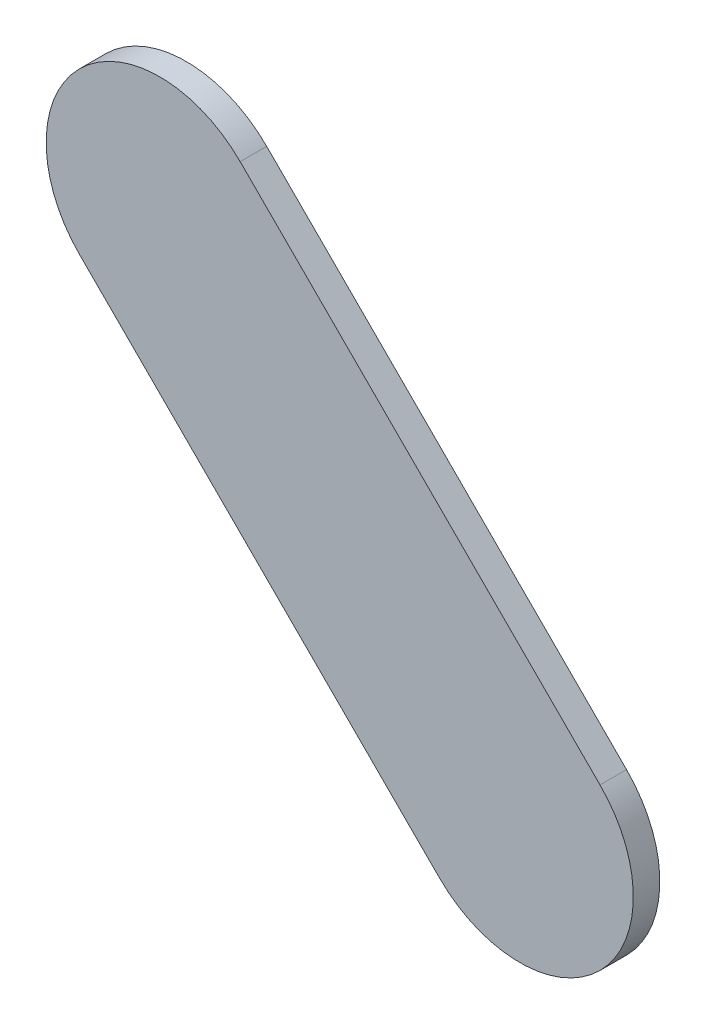
ISO-10303-21;
HEADER;
FILE_DESCRIPTION(('STEP AP214'),'2;1');
FILE_NAME('part.step','',(''),(''),'','','');
FILE_SCHEMA(('AUTOMOTIVE_DESIGN { 1 0 10303 214 1 1 1 1 }'));
ENDSEC;
DATA;
#1=APPLICATION_CONTEXT('core data for automotive mechanical design processes');
#2=APPLICATION_PROTOCOL_DEFINITION('international standard','automotive_design',2000,#1);
#3=PRODUCT_CONTEXT('',#1,'mechanical');
#4=PRODUCT('Part','Part','',(#3));
#5=PRODUCT_RELATED_PRODUCT_CATEGORY('part','',(#4));
#6=PRODUCT_DEFINITION_FORMATION('','',#4);
#7=PRODUCT_DEFINITION_CONTEXT('part definition',#1,'design');
#8=PRODUCT_DEFINITION('design','',#6,#7);
#9=PRODUCT_DEFINITION_SHAPE('','',#8);
#10=(LENGTH_UNIT() NAMED_UNIT(*) SI_UNIT(.MILLI.,.METRE.));
#11=(NAMED_UNIT(*) PLANE_ANGLE_UNIT() SI_UNIT($,.RADIAN.));
#12=(NAMED_UNIT(*) SI_UNIT($,.STERADIAN.) SOLID_ANGLE_UNIT());
#13=UNCERTAINTY_MEASURE_WITH_UNIT(LENGTH_MEASURE(1.E-05),#10,'distance_accuracy_value','');
#14=(GEOMETRIC_REPRESENTATION_CONTEXT(3) GLOBAL_UNCERTAINTY_ASSIGNED_CONTEXT((#13)) GLOBAL_UNIT_ASSIGNED_CONTEXT((#10,
#11,#12)) REPRESENTATION_CONTEXT('',''));
#15=CARTESIAN_POINT('',(0.,0.,0.));
#16=DIRECTION('',(0.,0.,1.));
#17=DIRECTION('',(1.,0.,0.));
#18=AXIS2_PLACEMENT_3D('',#15,#16,#17);
#19=CARTESIAN_POINT('',(94.783933,-69.646066,1.635));
#20=DIRECTION('',(0.,0.,1.));
#21=DIRECTION('',(1.,0.,0.));
#22=AXIS2_PLACEMENT_3D('',#19,#20,#21);
#23=PLANE('',#22);
#24=DIRECTION('',(0.707106781186548,-0.707106781186548,0.));
#25=VECTOR('',#24,1.);
#26=CARTESIAN_POINT('',(94.783933,-69.646066,1.635));
#27=LINE('',#26,#25);
#28=CARTESIAN_POINT('',(94.783933,-69.646066,1.635));
#29=VERTEX_POINT('',#28);
#30=CARTESIAN_POINT('',(95.258933,-70.121066,1.635));
#31=VERTEX_POINT('',#30);
#32=EDGE_CURVE('E83',#29,#31,#27,.T.);
#33=ORIENTED_EDGE('',*,*,#32,.T.);
#34=CARTESIAN_POINT('',(95.3649995,-70.0149995,1.635));
#35=DIRECTION('',(0.,0.,1.));
#36=DIRECTION('',(-0.707106781186548,-0.707106781186548,0.));
#37=AXIS2_PLACEMENT_3D('',#34,#35,#36);
#38=CIRCLE('',#37,0.150000682813);
#39=CARTESIAN_POINT('',(95.471066,-69.908933,1.635));
#40=VERTEX_POINT('',#39);
#41=EDGE_CURVE('E106',#31,#40,#38,.T.);
#42=ORIENTED_EDGE('',*,*,#41,.T.);
#43=DIRECTION('',(-0.707106781186548,0.707106781186548,0.));
#44=VECTOR('',#43,1.);
#45=CARTESIAN_POINT('',(95.471066,-69.908933,1.635));
#46=LINE('',#45,#44);
#47=CARTESIAN_POINT('',(94.996066,-69.433933,1.635));
#48=VERTEX_POINT('',#47);
#49=EDGE_CURVE('E75',#40,#48,#46,.T.);
#50=ORIENTED_EDGE('',*,*,#49,.T.);
#51=CARTESIAN_POINT('',(94.8899995,-69.5399995,1.635));
#52=DIRECTION('',(0.,0.,1.));
#53=DIRECTION('',(0.707106781186548,0.707106781186548,0.));
#54=AXIS2_PLACEMENT_3D('',#51,#52,#53);
#55=CIRCLE('',#54,0.150000682813);
#56=EDGE_CURVE('E11',#48,#29,#55,.T.);
#57=ORIENTED_EDGE('',*,*,#56,.T.);
#58=EDGE_LOOP('',(#33,#42,#50,#57));
#59=FACE_BOUND('',#58,.T.);
#60=ADVANCED_FACE('F17',(#59),#23,.T.);
#61=CARTESIAN_POINT('',(94.783933,-69.646066,1.6));
#62=DIRECTION('',(0.,0.,1.));
#63=DIRECTION('',(1.,0.,0.));
#64=AXIS2_PLACEMENT_3D('',#61,#62,#63);
#65=PLANE('',#64);
#66=CARTESIAN_POINT('',(94.8899995,-69.5399995,1.6));
#67=DIRECTION('',(0.,0.,1.));
#68=DIRECTION('',(0.707106781186548,0.707106781186548,0.));
#69=AXIS2_PLACEMENT_3D('',#66,#67,#68);
#70=CIRCLE('',#69,0.150000682813);
#71=CARTESIAN_POINT('',(94.996066,-69.433933,1.6));
#72=VERTEX_POINT('',#71);
#73=CARTESIAN_POINT('',(94.783933,-69.646066,1.6));
#74=VERTEX_POINT('',#73);
#75=EDGE_CURVE('E26',#72,#74,#70,.T.);
#76=ORIENTED_EDGE('',*,*,#75,.F.);
#77=DIRECTION('',(-0.707106781186548,0.707106781186548,0.));
#78=VECTOR('',#77,1.);
#79=CARTESIAN_POINT('',(95.471066,-69.908933,1.6));
#80=LINE('',#79,#78);
#81=CARTESIAN_POINT('',(95.471066,-69.908933,1.6));
#82=VERTEX_POINT('',#81);
#83=EDGE_CURVE('E107',#82,#72,#80,.T.);
#84=ORIENTED_EDGE('',*,*,#83,.F.);
#85=CARTESIAN_POINT('',(95.3649995,-70.0149995,1.6));
#86=DIRECTION('',(0.,0.,1.));
#87=DIRECTION('',(-0.707106781186548,-0.707106781186548,0.));
#88=AXIS2_PLACEMENT_3D('',#85,#86,#87);
#89=CIRCLE('',#88,0.150000682813);
#90=CARTESIAN_POINT('',(95.258933,-70.121066,1.6));
#91=VERTEX_POINT('',#90);
#92=EDGE_CURVE('E85',#91,#82,#89,.T.);
#93=ORIENTED_EDGE('',*,*,#92,.F.);
#94=DIRECTION('',(0.707106781186548,-0.707106781186548,0.));
#95=VECTOR('',#94,1.);
#96=CARTESIAN_POINT('',(94.783933,-69.646066,1.6));
#97=LINE('',#96,#95);
#98=EDGE_CURVE('E81',#74,#91,#97,.T.);
#99=ORIENTED_EDGE('',*,*,#98,.F.);
#100=EDGE_LOOP('',(#76,#84,#93,#99));
#101=FACE_BOUND('',#100,.T.);
#102=ADVANCED_FACE('F19',(#101),#65,.F.);
#103=CARTESIAN_POINT('',(94.8899995,-69.5399995,1.6));
#104=DIRECTION('',(0.,0.,-1.));
#105=DIRECTION('',(0.707106781186548,0.707106781186548,0.));
#106=AXIS2_PLACEMENT_3D('',#103,#104,#105);
#107=CYLINDRICAL_SURFACE('',#106,0.150000682813);
#108=ORIENTED_EDGE('',*,*,#75,.T.);
#109=DIRECTION('',(0.,0.,1.));
#110=VECTOR('',#109,1.);
#111=CARTESIAN_POINT('',(94.783933,-69.646066,1.6));
#112=LINE('',#111,#110);
#113=EDGE_CURVE('E69',#74,#29,#112,.T.);
#114=ORIENTED_EDGE('',*,*,#113,.T.);
#115=ORIENTED_EDGE('',*,*,#56,.F.);
#116=DIRECTION('',(0.,0.,1.));
#117=VECTOR('',#116,1.);
#118=CARTESIAN_POINT('',(94.996066,-69.433933,1.6));
#119=LINE('',#118,#117);
#120=EDGE_CURVE('E72',#72,#48,#119,.T.);
#121=ORIENTED_EDGE('',*,*,#120,.F.);
#122=EDGE_LOOP('',(#108,#114,#115,#121));
#123=FACE_BOUND('',#122,.T.);
#124=ADVANCED_FACE('F68',(#123),#107,.T.);
#125=CARTESIAN_POINT('',(95.471066,-69.908933,1.6));
#126=DIRECTION('',(-0.707106781186548,-0.707106781186548,0.));
#127=DIRECTION('',(-0.707106781186548,0.707106781186548,0.));
#128=AXIS2_PLACEMENT_3D('',#125,#126,#127);
#129=PLANE('',#128);
#130=ORIENTED_EDGE('',*,*,#83,.T.);
#131=ORIENTED_EDGE('',*,*,#120,.T.);
#132=ORIENTED_EDGE('',*,*,#49,.F.);
#133=DIRECTION('',(0.,0.,1.));
#134=VECTOR('',#133,1.);
#135=CARTESIAN_POINT('',(95.471066,-69.908933,1.6));
#136=LINE('',#135,#134);
#137=EDGE_CURVE('E102',#82,#40,#136,.T.);
#138=ORIENTED_EDGE('',*,*,#137,.F.);
#139=EDGE_LOOP('',(#130,#131,#132,#138));
#140=FACE_BOUND('',#139,.T.);
#141=ADVANCED_FACE('F120',(#140),#129,.F.);
#142=CARTESIAN_POINT('',(95.3649995,-70.0149995,1.6));
#143=DIRECTION('',(0.,0.,-1.));
#144=DIRECTION('',(-0.707106781186548,-0.707106781186548,0.));
#145=AXIS2_PLACEMENT_3D('',#142,#143,#144);
#146=CYLINDRICAL_SURFACE('',#145,0.150000682813);
#147=ORIENTED_EDGE('',*,*,#92,.T.);
#148=ORIENTED_EDGE('',*,*,#137,.T.);
#149=ORIENTED_EDGE('',*,*,#41,.F.);
#150=DIRECTION('',(0.,0.,1.));
#151=VECTOR('',#150,1.);
#152=CARTESIAN_POINT('',(95.258933,-70.121066,1.6));
#153=LINE('',#152,#151);
#154=EDGE_CURVE('E90',#91,#31,#153,.T.);
#155=ORIENTED_EDGE('',*,*,#154,.F.);
#156=EDGE_LOOP('',(#147,#148,#149,#155));
#157=FACE_BOUND('',#156,.T.);
#158=ADVANCED_FACE('F122',(#157),#146,.T.);
#159=CARTESIAN_POINT('',(94.783933,-69.646066,1.6));
#160=DIRECTION('',(0.707106781186548,0.707106781186548,0.));
#161=DIRECTION('',(0.,0.,-1.));
#162=AXIS2_PLACEMENT_3D('',#159,#160,#161);
#163=PLANE('',#162);
#164=ORIENTED_EDGE('',*,*,#98,.T.);
#165=ORIENTED_EDGE('',*,*,#154,.T.);
#166=ORIENTED_EDGE('',*,*,#32,.F.);
#167=ORIENTED_EDGE('',*,*,#113,.F.);
#168=EDGE_LOOP('',(#164,#165,#166,#167));
#169=FACE_BOUND('',#168,.T.);
#170=ADVANCED_FACE('F79',(#169),#163,.F.);
#171=CLOSED_SHELL('',(#60,#102,#124,#141,#158,#170));
#172=MANIFOLD_SOLID_BREP('B1',#171);
#173=ADVANCED_BREP_SHAPE_REPRESENTATION('',(#18,#172),#14);
#174=SHAPE_DEFINITION_REPRESENTATION(#9,#173);
ENDSEC;
END-ISO-10303-21;
